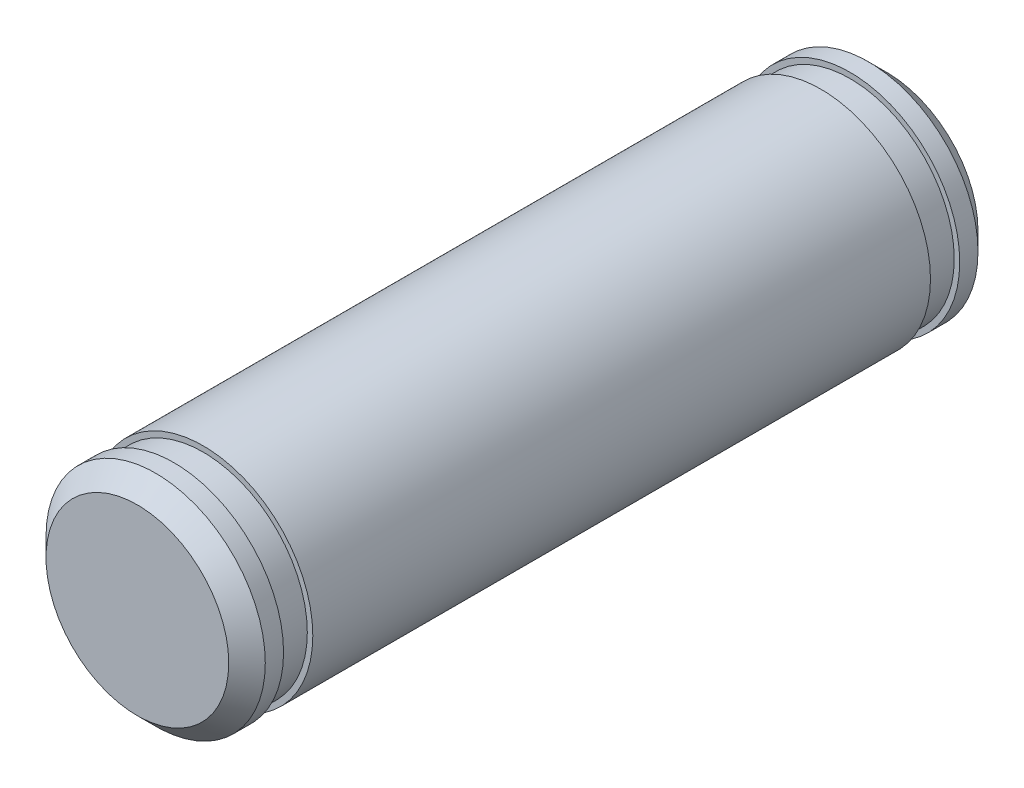
ISO-10303-21;
HEADER;
FILE_DESCRIPTION(('STEP AP214'),'2;1');
FILE_NAME('part.step','',(''),(''),'','','');
FILE_SCHEMA(('AUTOMOTIVE_DESIGN { 1 0 10303 214 1 1 1 1 }'));
ENDSEC;
DATA;
#1=APPLICATION_CONTEXT('core data for automotive mechanical design processes');
#2=APPLICATION_PROTOCOL_DEFINITION('international standard','automotive_design',2000,#1);
#3=PRODUCT_CONTEXT('',#1,'mechanical');
#4=PRODUCT('Part','Part','',(#3));
#5=PRODUCT_RELATED_PRODUCT_CATEGORY('part','',(#4));
#6=PRODUCT_DEFINITION_FORMATION('','',#4);
#7=PRODUCT_DEFINITION_CONTEXT('part definition',#1,'design');
#8=PRODUCT_DEFINITION('design','',#6,#7);
#9=PRODUCT_DEFINITION_SHAPE('','',#8);
#10=(LENGTH_UNIT() NAMED_UNIT(*) SI_UNIT(.MILLI.,.METRE.));
#11=(NAMED_UNIT(*) PLANE_ANGLE_UNIT() SI_UNIT($,.RADIAN.));
#12=(NAMED_UNIT(*) SI_UNIT($,.STERADIAN.) SOLID_ANGLE_UNIT());
#13=UNCERTAINTY_MEASURE_WITH_UNIT(LENGTH_MEASURE(1.E-05),#10,'distance_accuracy_value','');
#14=(GEOMETRIC_REPRESENTATION_CONTEXT(3) GLOBAL_UNCERTAINTY_ASSIGNED_CONTEXT((#13)) GLOBAL_UNIT_ASSIGNED_CONTEXT((#10,
#11,#12)) REPRESENTATION_CONTEXT('',''));
#15=CARTESIAN_POINT('',(0.,0.,0.));
#16=DIRECTION('',(0.,0.,1.));
#17=DIRECTION('',(1.,0.,0.));
#18=AXIS2_PLACEMENT_3D('',#15,#16,#17);
#19=CARTESIAN_POINT('',(0.,0.,20.5));
#20=DIRECTION('',(0.,0.,-1.));
#21=DIRECTION('',(-1.,0.,0.));
#22=AXIS2_PLACEMENT_3D('',#19,#20,#21);
#23=CYLINDRICAL_SURFACE('',#22,3.);
#24=CARTESIAN_POINT('',(0.,0.,1.8));
#25=DIRECTION('',(0.,0.,1.));
#26=DIRECTION('',(1.,0.,0.));
#27=AXIS2_PLACEMENT_3D('',#24,#25,#26);
#28=CIRCLE('',#27,3.);
#29=CARTESIAN_POINT('',(3.,0.,1.8));
#30=VERTEX_POINT('',#29);
#31=EDGE_CURVE('E68',#30,#30,#28,.T.);
#32=ORIENTED_EDGE('',*,*,#31,.T.);
#33=EDGE_LOOP('',(#32));
#34=FACE_BOUND('',#33,.T.);
#35=CARTESIAN_POINT('',(0.,0.,18.7));
#36=DIRECTION('',(0.,0.,1.));
#37=DIRECTION('',(1.,0.,0.));
#38=AXIS2_PLACEMENT_3D('',#35,#36,#37);
#39=CIRCLE('',#38,3.);
#40=CARTESIAN_POINT('',(3.,0.,18.7));
#41=VERTEX_POINT('',#40);
#42=EDGE_CURVE('E58',#41,#41,#39,.T.);
#43=ORIENTED_EDGE('',*,*,#42,.F.);
#44=EDGE_LOOP('',(#43));
#45=FACE_BOUND('',#44,.T.);
#46=ADVANCED_FACE('F37',(#34,#45),#23,.T.);
#47=CARTESIAN_POINT('',(0.,0.,18.7));
#48=DIRECTION('',(0.,0.,1.));
#49=DIRECTION('',(1.,0.,0.));
#50=AXIS2_PLACEMENT_3D('',#47,#48,#49);
#51=PLANE('',#50);
#52=CARTESIAN_POINT('',(0.,0.,18.7));
#53=DIRECTION('',(0.,0.,1.));
#54=DIRECTION('',(1.,0.,0.));
#55=AXIS2_PLACEMENT_3D('',#52,#53,#54);
#56=CIRCLE('',#55,2.85);
#57=CARTESIAN_POINT('',(2.85,0.,18.7));
#58=VERTEX_POINT('',#57);
#59=EDGE_CURVE('E62',#58,#58,#56,.T.);
#60=ORIENTED_EDGE('',*,*,#59,.F.);
#61=EDGE_LOOP('',(#60));
#62=FACE_BOUND('',#61,.T.);
#63=ORIENTED_EDGE('',*,*,#42,.T.);
#64=EDGE_LOOP('',(#63));
#65=FACE_BOUND('',#64,.T.);
#66=ADVANCED_FACE('F104',(#62,#65),#51,.T.);
#67=CARTESIAN_POINT('',(0.,0.,19.5));
#68=DIRECTION('',(0.,0.,1.));
#69=DIRECTION('',(1.,0.,0.));
#70=AXIS2_PLACEMENT_3D('',#67,#68,#69);
#71=PLANE('',#70);
#72=CARTESIAN_POINT('',(0.,0.,19.5));
#73=DIRECTION('',(0.,0.,1.));
#74=DIRECTION('',(1.,0.,0.));
#75=AXIS2_PLACEMENT_3D('',#72,#73,#74);
#76=CIRCLE('',#75,2.85);
#77=CARTESIAN_POINT('',(2.85,0.,19.5));
#78=VERTEX_POINT('',#77);
#79=EDGE_CURVE('E65',#78,#78,#76,.T.);
#80=ORIENTED_EDGE('',*,*,#79,.T.);
#81=EDGE_LOOP('',(#80));
#82=FACE_BOUND('',#81,.T.);
#83=CARTESIAN_POINT('',(0.,0.,19.5));
#84=DIRECTION('',(0.,0.,1.));
#85=DIRECTION('',(1.,0.,0.));
#86=AXIS2_PLACEMENT_3D('',#83,#84,#85);
#87=CIRCLE('',#86,3.);
#88=CARTESIAN_POINT('',(3.,0.,19.5));
#89=VERTEX_POINT('',#88);
#90=EDGE_CURVE('E59',#89,#89,#87,.T.);
#91=ORIENTED_EDGE('',*,*,#90,.F.);
#92=EDGE_LOOP('',(#91));
#93=FACE_BOUND('',#92,.T.);
#94=ADVANCED_FACE('F111',(#82,#93),#71,.F.);
#95=CARTESIAN_POINT('',(0.,0.,18.7));
#96=DIRECTION('',(0.,0.,1.));
#97=DIRECTION('',(1.,0.,0.));
#98=AXIS2_PLACEMENT_3D('',#95,#96,#97);
#99=CYLINDRICAL_SURFACE('',#98,2.85);
#100=ORIENTED_EDGE('',*,*,#59,.T.);
#101=EDGE_LOOP('',(#100));
#102=FACE_BOUND('',#101,.T.);
#103=ORIENTED_EDGE('',*,*,#79,.F.);
#104=EDGE_LOOP('',(#103));
#105=FACE_BOUND('',#104,.T.);
#106=ADVANCED_FACE('F136',(#102,#105),#99,.T.);
#107=CARTESIAN_POINT('',(0.,0.,20.5));
#108=DIRECTION('',(0.,0.,1.));
#109=DIRECTION('',(1.,0.,0.));
#110=AXIS2_PLACEMENT_3D('',#107,#108,#109);
#111=PLANE('',#110);
#112=CARTESIAN_POINT('',(0.,0.,20.5));
#113=DIRECTION('',(0.,0.,1.));
#114=DIRECTION('',(1.,0.,0.));
#115=AXIS2_PLACEMENT_3D('',#112,#113,#114);
#116=CIRCLE('',#115,2.5);
#117=CARTESIAN_POINT('',(2.5,0.,20.5));
#118=VERTEX_POINT('',#117);
#119=EDGE_CURVE('E45',#118,#118,#116,.T.);
#120=ORIENTED_EDGE('',*,*,#119,.T.);
#121=EDGE_LOOP('',(#120));
#122=FACE_BOUND('',#121,.T.);
#123=ADVANCED_FACE('F117',(#122),#111,.T.);
#124=CARTESIAN_POINT('',(0.,0.,20.));
#125=DIRECTION('',(0.,0.,1.));
#126=DIRECTION('',(1.,0.,0.));
#127=AXIS2_PLACEMENT_3D('',#124,#125,#126);
#128=CIRCLE('',#127,3.);
#129=CARTESIAN_POINT('',(3.,0.,20.));
#130=VERTEX_POINT('',#129);
#131=EDGE_CURVE('E10',#130,#130,#128,.F.);
#132=ORIENTED_EDGE('',*,*,#131,.T.);
#133=EDGE_LOOP('',(#132));
#134=FACE_BOUND('',#133,.T.);
#135=ORIENTED_EDGE('',*,*,#90,.T.);
#136=EDGE_LOOP('',(#135));
#137=FACE_BOUND('',#136,.T.);
#138=ADVANCED_FACE('F99',(#134,#137),#23,.T.);
#139=CARTESIAN_POINT('',(0.,0.,1.8));
#140=DIRECTION('',(0.,0.,1.));
#141=DIRECTION('',(1.,0.,0.));
#142=AXIS2_PLACEMENT_3D('',#139,#140,#141);
#143=PLANE('',#142);
#144=ORIENTED_EDGE('',*,*,#31,.F.);
#145=EDGE_LOOP('',(#144));
#146=FACE_BOUND('',#145,.T.);
#147=CARTESIAN_POINT('',(0.,0.,1.8));
#148=DIRECTION('',(0.,0.,1.));
#149=DIRECTION('',(1.,0.,0.));
#150=AXIS2_PLACEMENT_3D('',#147,#148,#149);
#151=CIRCLE('',#150,2.85);
#152=CARTESIAN_POINT('',(2.85,0.,1.8));
#153=VERTEX_POINT('',#152);
#154=EDGE_CURVE('E74',#153,#153,#151,.T.);
#155=ORIENTED_EDGE('',*,*,#154,.T.);
#156=EDGE_LOOP('',(#155));
#157=FACE_BOUND('',#156,.T.);
#158=ADVANCED_FACE('F83',(#146,#157),#143,.F.);
#159=CARTESIAN_POINT('',(0.,0.,1.));
#160=DIRECTION('',(0.,0.,1.));
#161=DIRECTION('',(1.,0.,0.));
#162=AXIS2_PLACEMENT_3D('',#159,#160,#161);
#163=PLANE('',#162);
#164=CARTESIAN_POINT('',(0.,0.,1.));
#165=DIRECTION('',(0.,0.,1.));
#166=DIRECTION('',(1.,0.,0.));
#167=AXIS2_PLACEMENT_3D('',#164,#165,#166);
#168=CIRCLE('',#167,3.);
#169=CARTESIAN_POINT('',(3.,0.,1.));
#170=VERTEX_POINT('',#169);
#171=EDGE_CURVE('E71',#170,#170,#168,.T.);
#172=ORIENTED_EDGE('',*,*,#171,.T.);
#173=EDGE_LOOP('',(#172));
#174=FACE_BOUND('',#173,.T.);
#175=CARTESIAN_POINT('',(0.,0.,1.));
#176=DIRECTION('',(0.,0.,1.));
#177=DIRECTION('',(1.,0.,0.));
#178=AXIS2_PLACEMENT_3D('',#175,#176,#177);
#179=CIRCLE('',#178,2.85);
#180=CARTESIAN_POINT('',(2.85,0.,1.));
#181=VERTEX_POINT('',#180);
#182=EDGE_CURVE('E77',#181,#181,#179,.T.);
#183=ORIENTED_EDGE('',*,*,#182,.F.);
#184=EDGE_LOOP('',(#183));
#185=FACE_BOUND('',#184,.T.);
#186=ADVANCED_FACE('F89',(#174,#185),#163,.T.);
#187=CARTESIAN_POINT('',(0.,0.,1.8));
#188=DIRECTION('',(0.,0.,-1.));
#189=DIRECTION('',(-1.,0.,0.));
#190=AXIS2_PLACEMENT_3D('',#187,#188,#189);
#191=CYLINDRICAL_SURFACE('',#190,2.85);
#192=ORIENTED_EDGE('',*,*,#154,.F.);
#193=EDGE_LOOP('',(#192));
#194=FACE_BOUND('',#193,.T.);
#195=ORIENTED_EDGE('',*,*,#182,.T.);
#196=EDGE_LOOP('',(#195));
#197=FACE_BOUND('',#196,.T.);
#198=ADVANCED_FACE('F85',(#194,#197),#191,.T.);
#199=CARTESIAN_POINT('',(0.,0.,0.));
#200=DIRECTION('',(0.,0.,1.));
#201=DIRECTION('',(1.,0.,0.));
#202=AXIS2_PLACEMENT_3D('',#199,#200,#201);
#203=PLANE('',#202);
#204=CARTESIAN_POINT('',(0.,0.,0.));
#205=DIRECTION('',(0.,0.,1.));
#206=DIRECTION('',(1.,0.,0.));
#207=AXIS2_PLACEMENT_3D('',#204,#205,#206);
#208=CIRCLE('',#207,2.49999999999999);
#209=CARTESIAN_POINT('',(2.49999999999999,0.,0.));
#210=VERTEX_POINT('',#209);
#211=EDGE_CURVE('E49',#210,#210,#208,.F.);
#212=ORIENTED_EDGE('',*,*,#211,.T.);
#213=EDGE_LOOP('',(#212));
#214=FACE_BOUND('',#213,.T.);
#215=ADVANCED_FACE('F88',(#214),#203,.F.);
#216=CARTESIAN_POINT('',(0.,0.,0.500000000000007));
#217=DIRECTION('',(0.,0.,1.));
#218=DIRECTION('',(1.,0.,0.));
#219=AXIS2_PLACEMENT_3D('',#216,#217,#218);
#220=CIRCLE('',#219,3.);
#221=CARTESIAN_POINT('',(3.,0.,0.500000000000007));
#222=VERTEX_POINT('',#221);
#223=EDGE_CURVE('E53',#222,#222,#220,.T.);
#224=ORIENTED_EDGE('',*,*,#223,.T.);
#225=EDGE_LOOP('',(#224));
#226=FACE_BOUND('',#225,.T.);
#227=ORIENTED_EDGE('',*,*,#171,.F.);
#228=EDGE_LOOP('',(#227));
#229=FACE_BOUND('',#228,.T.);
#230=ADVANCED_FACE('F107',(#226,#229),#23,.T.);
#231=CARTESIAN_POINT('',(0.,0.,0.500000000000007));
#232=DIRECTION('',(0.,0.,1.));
#233=DIRECTION('',(1.,0.,0.));
#234=AXIS2_PLACEMENT_3D('',#231,#232,#233);
#235=CONICAL_SURFACE('',#234,3.,0.785398163397449);
#236=ORIENTED_EDGE('',*,*,#211,.F.);
#237=EDGE_LOOP('',(#236));
#238=FACE_BOUND('',#237,.T.);
#239=ORIENTED_EDGE('',*,*,#223,.F.);
#240=EDGE_LOOP('',(#239));
#241=FACE_BOUND('',#240,.T.);
#242=ADVANCED_FACE('F119',(#238,#241),#235,.T.);
#243=CARTESIAN_POINT('',(0.,0.,20.5));
#244=DIRECTION('',(0.,0.,-1.));
#245=DIRECTION('',(-1.,0.,0.));
#246=AXIS2_PLACEMENT_3D('',#243,#244,#245);
#247=CONICAL_SURFACE('',#246,2.5,0.785398163397443);
#248=ORIENTED_EDGE('',*,*,#131,.F.);
#249=EDGE_LOOP('',(#248));
#250=FACE_BOUND('',#249,.T.);
#251=ORIENTED_EDGE('',*,*,#119,.F.);
#252=EDGE_LOOP('',(#251));
#253=FACE_BOUND('',#252,.T.);
#254=ADVANCED_FACE('F40',(#250,#253),#247,.T.);
#255=CLOSED_SHELL('',(#46,#66,#94,#106,#123,#138,#158,#186,#198,#215,#230,#242,#254));
#256=MANIFOLD_SOLID_BREP('B2',#255);
#257=ADVANCED_BREP_SHAPE_REPRESENTATION('',(#18,#256),#14);
#258=SHAPE_DEFINITION_REPRESENTATION(#9,#257);
ENDSEC;
END-ISO-10303-21;
